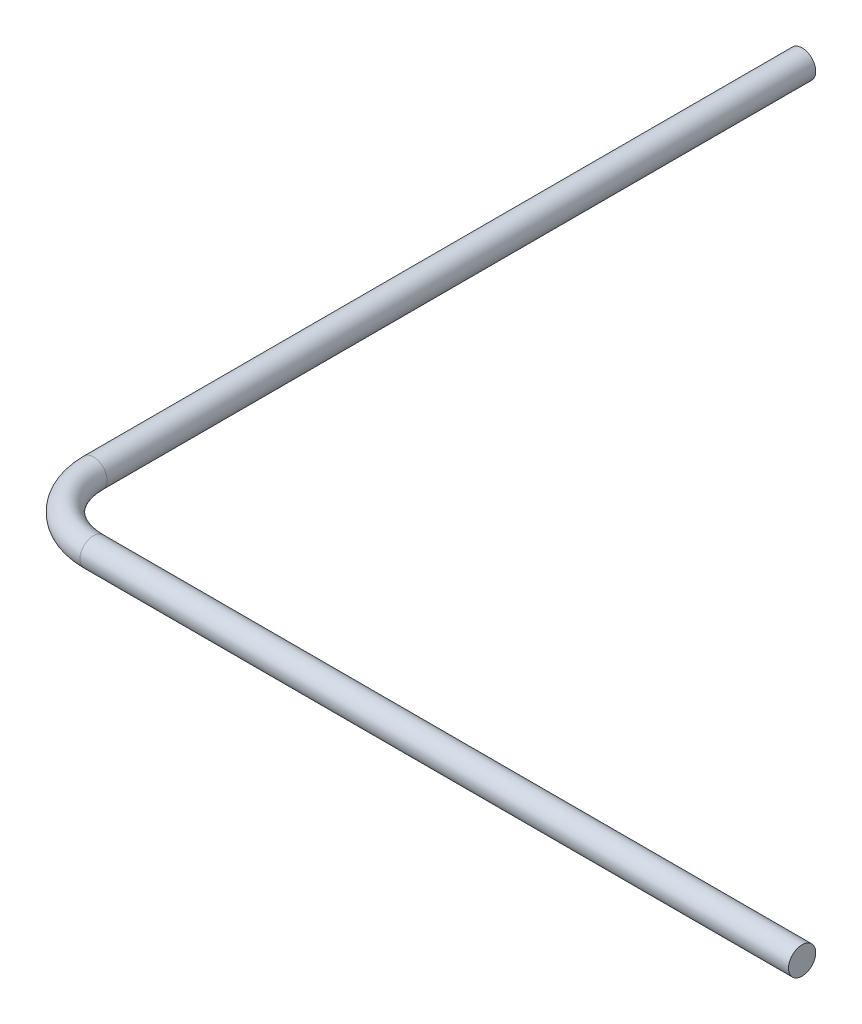
ISO-10303-21;
HEADER;
FILE_DESCRIPTION(('STEP AP214'),'2;1');
FILE_NAME('part.step','',(''),(''),'','','');
FILE_SCHEMA(('AUTOMOTIVE_DESIGN { 1 0 10303 214 1 1 1 1 }'));
ENDSEC;
DATA;
#1=APPLICATION_CONTEXT('core data for automotive mechanical design processes');
#2=APPLICATION_PROTOCOL_DEFINITION('international standard','automotive_design',2000,#1);
#3=PRODUCT_CONTEXT('',#1,'mechanical');
#4=PRODUCT('Part','Part','',(#3));
#5=PRODUCT_RELATED_PRODUCT_CATEGORY('part','',(#4));
#6=PRODUCT_DEFINITION_FORMATION('','',#4);
#7=PRODUCT_DEFINITION_CONTEXT('part definition',#1,'design');
#8=PRODUCT_DEFINITION('design','',#6,#7);
#9=PRODUCT_DEFINITION_SHAPE('','',#8);
#10=(LENGTH_UNIT() NAMED_UNIT(*) SI_UNIT(.MILLI.,.METRE.));
#11=(NAMED_UNIT(*) PLANE_ANGLE_UNIT() SI_UNIT($,.RADIAN.));
#12=(NAMED_UNIT(*) SI_UNIT($,.STERADIAN.) SOLID_ANGLE_UNIT());
#13=UNCERTAINTY_MEASURE_WITH_UNIT(LENGTH_MEASURE(1.E-05),#10,'distance_accuracy_value','');
#14=(GEOMETRIC_REPRESENTATION_CONTEXT(3) GLOBAL_UNCERTAINTY_ASSIGNED_CONTEXT((#13)) GLOBAL_UNIT_ASSIGNED_CONTEXT((#10,
#11,#12)) REPRESENTATION_CONTEXT('',''));
#15=CARTESIAN_POINT('',(0.,0.,0.));
#16=DIRECTION('',(0.,0.,1.));
#17=DIRECTION('',(1.,0.,0.));
#18=AXIS2_PLACEMENT_3D('',#15,#16,#17);
#19=CARTESIAN_POINT('',(0.,0.,50.));
#20=DIRECTION('',(0.,0.,-1.));
#21=DIRECTION('',(-1.,0.,0.));
#22=AXIS2_PLACEMENT_3D('',#19,#20,#21);
#23=CYLINDRICAL_SURFACE('',#22,1.);
#24=CARTESIAN_POINT('',(0.,0.,0.));
#25=DIRECTION('',(0.,0.,1.));
#26=DIRECTION('',(1.,0.,0.));
#27=AXIS2_PLACEMENT_3D('',#24,#25,#26);
#28=CIRCLE('',#27,1.);
#29=CARTESIAN_POINT('',(1.,0.,0.));
#30=VERTEX_POINT('',#29);
#31=EDGE_CURVE('E10',#30,#30,#28,.T.);
#32=ORIENTED_EDGE('',*,*,#31,.T.);
#33=EDGE_LOOP('',(#32));
#34=FACE_BOUND('',#33,.T.);
#35=CARTESIAN_POINT('',(0.,0.,52.));
#36=DIRECTION('',(0.,0.,1.));
#37=DIRECTION('',(1.,0.,0.));
#38=AXIS2_PLACEMENT_3D('',#35,#36,#37);
#39=CIRCLE('',#38,1.);
#40=CARTESIAN_POINT('',(-0.999999999999788,0.,52.));
#41=VERTEX_POINT('',#40);
#42=EDGE_CURVE('E56',#41,#41,#39,.T.);
#43=ORIENTED_EDGE('',*,*,#42,.F.);
#44=EDGE_LOOP('',(#43));
#45=FACE_BOUND('',#44,.T.);
#46=ADVANCED_FACE('F39',(#34,#45),#23,.T.);
#47=CARTESIAN_POINT('',(0.,0.,0.));
#48=DIRECTION('',(0.,0.,1.));
#49=DIRECTION('',(1.,0.,0.));
#50=AXIS2_PLACEMENT_3D('',#47,#48,#49);
#51=PLANE('',#50);
#52=ORIENTED_EDGE('',*,*,#31,.F.);
#53=EDGE_LOOP('',(#52));
#54=FACE_BOUND('',#53,.T.);
#55=ADVANCED_FACE('F66',(#54),#51,.F.);
#56=CARTESIAN_POINT('',(57.,0.,57.));
#57=DIRECTION('',(1.,0.,0.));
#58=DIRECTION('',(0.,0.,-1.));
#59=AXIS2_PLACEMENT_3D('',#56,#57,#58);
#60=PLANE('',#59);
#61=CARTESIAN_POINT('',(57.,0.,57.));
#62=DIRECTION('',(1.,0.,0.));
#63=DIRECTION('',(0.,0.,-1.));
#64=AXIS2_PLACEMENT_3D('',#61,#62,#63);
#65=CIRCLE('',#64,1.);
#66=CARTESIAN_POINT('',(57.,0.,56.));
#67=VERTEX_POINT('',#66);
#68=EDGE_CURVE('E46',#67,#67,#65,.T.);
#69=ORIENTED_EDGE('',*,*,#68,.T.);
#70=EDGE_LOOP('',(#69));
#71=FACE_BOUND('',#70,.T.);
#72=ADVANCED_FACE('F70',(#71),#60,.T.);
#73=CARTESIAN_POINT('',(5.,0.,52.));
#74=DIRECTION('',(0.,1.,0.));
#75=DIRECTION('',(0.,0.,1.));
#76=AXIS2_PLACEMENT_3D('',#73,#74,#75);
#77=TOROIDAL_SURFACE('',#76,4.99999999999979,1.);
#78=CARTESIAN_POINT('',(5.,0.,57.));
#79=DIRECTION('',(1.,0.,0.));
#80=DIRECTION('',(0.,0.,-1.));
#81=AXIS2_PLACEMENT_3D('',#78,#79,#80);
#82=CIRCLE('',#81,1.);
#83=CARTESIAN_POINT('',(5.00000000000001,0.,57.9999999999998));
#84=VERTEX_POINT('',#83);
#85=EDGE_CURVE('E51',#84,#84,#82,.T.);
#86=CARTESIAN_POINT('',(5.,0.,52.));
#87=DIRECTION('',(0.,1.,0.));
#88=DIRECTION('',(0.,0.,1.));
#89=AXIS2_PLACEMENT_3D('',#86,#87,#88);
#90=CIRCLE('',#89,5.99999999999979);
#91=EDGE_CURVE('',#41,#84,#90,.T.);
#92=ORIENTED_EDGE('',*,*,#42,.T.);
#93=ORIENTED_EDGE('',*,*,#85,.F.);
#94=ORIENTED_EDGE('',*,*,#91,.T.);
#95=ORIENTED_EDGE('',*,*,#91,.F.);
#96=EDGE_LOOP('',(#92,#94,#93,#95));
#97=FACE_BOUND('',#96,.T.);
#98=ADVANCED_FACE('F63',(#97),#77,.T.);
#99=CARTESIAN_POINT('',(5.,0.,57.));
#100=DIRECTION('',(1.,0.,0.));
#101=DIRECTION('',(0.,0.,-1.));
#102=AXIS2_PLACEMENT_3D('',#99,#100,#101);
#103=CYLINDRICAL_SURFACE('',#102,1.);
#104=ORIENTED_EDGE('',*,*,#68,.F.);
#105=EDGE_LOOP('',(#104));
#106=FACE_BOUND('',#105,.T.);
#107=ORIENTED_EDGE('',*,*,#85,.T.);
#108=EDGE_LOOP('',(#107));
#109=FACE_BOUND('',#108,.T.);
#110=ADVANCED_FACE('F72',(#106,#109),#103,.T.);
#111=CLOSED_SHELL('',(#46,#55,#72,#98,#110));
#112=MANIFOLD_SOLID_BREP('B2',#111);
#113=ADVANCED_BREP_SHAPE_REPRESENTATION('',(#18,#112),#14);
#114=SHAPE_DEFINITION_REPRESENTATION(#9,#113);
ENDSEC;
END-ISO-10303-21;
